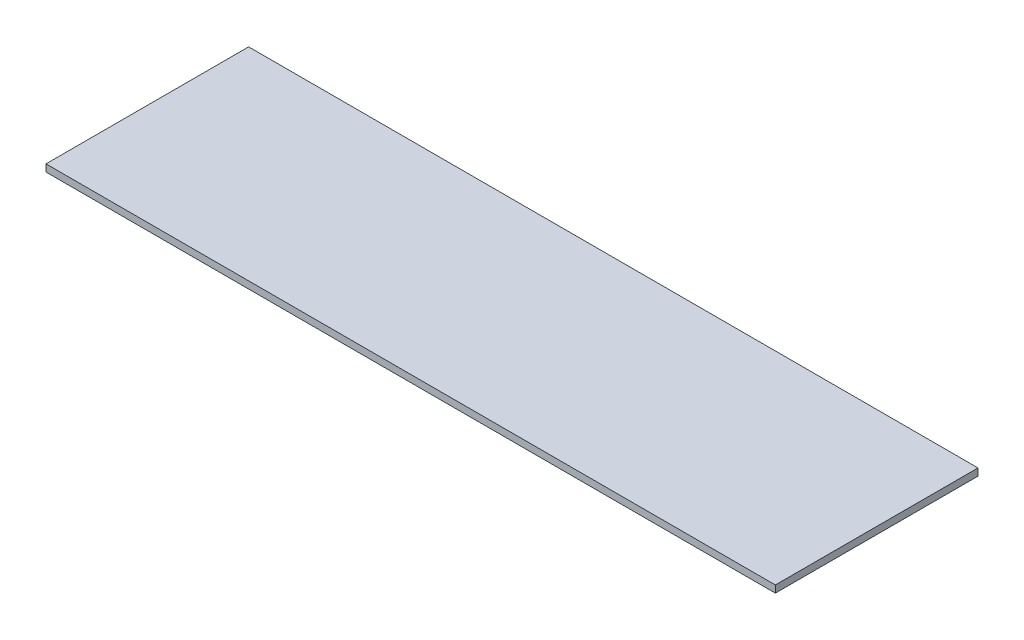
ISO-10303-21;
HEADER;
FILE_DESCRIPTION(('STEP AP214'),'2;1');
FILE_NAME('part.step','',(''),(''),'','','');
FILE_SCHEMA(('AUTOMOTIVE_DESIGN { 1 0 10303 214 1 1 1 1 }'));
ENDSEC;
DATA;
#1=APPLICATION_CONTEXT('core data for automotive mechanical design processes');
#2=APPLICATION_PROTOCOL_DEFINITION('international standard','automotive_design',2000,#1);
#3=PRODUCT_CONTEXT('',#1,'mechanical');
#4=PRODUCT('Part','Part','',(#3));
#5=PRODUCT_RELATED_PRODUCT_CATEGORY('part','',(#4));
#6=PRODUCT_DEFINITION_FORMATION('','',#4);
#7=PRODUCT_DEFINITION_CONTEXT('part definition',#1,'design');
#8=PRODUCT_DEFINITION('design','',#6,#7);
#9=PRODUCT_DEFINITION_SHAPE('','',#8);
#10=(LENGTH_UNIT() NAMED_UNIT(*) SI_UNIT(.MILLI.,.METRE.));
#11=(NAMED_UNIT(*) PLANE_ANGLE_UNIT() SI_UNIT($,.RADIAN.));
#12=(NAMED_UNIT(*) SI_UNIT($,.STERADIAN.) SOLID_ANGLE_UNIT());
#13=UNCERTAINTY_MEASURE_WITH_UNIT(LENGTH_MEASURE(1.E-05),#10,'distance_accuracy_value','');
#14=(GEOMETRIC_REPRESENTATION_CONTEXT(3) GLOBAL_UNCERTAINTY_ASSIGNED_CONTEXT((#13)) GLOBAL_UNIT_ASSIGNED_CONTEXT((#10,
#11,#12)) REPRESENTATION_CONTEXT('',''));
#15=CARTESIAN_POINT('',(0.,0.,0.));
#16=DIRECTION('',(0.,0.,1.));
#17=DIRECTION('',(1.,0.,0.));
#18=AXIS2_PLACEMENT_3D('',#15,#16,#17);
#19=CARTESIAN_POINT('',(-425.728806941432,5.,-49.8109978308026));
#20=DIRECTION('',(0.,0.,-1.));
#21=DIRECTION('',(-1.,0.,0.));
#22=AXIS2_PLACEMENT_3D('',#19,#20,#21);
#23=PLANE('',#22);
#24=DIRECTION('',(1.,0.,0.));
#25=VECTOR('',#24,1.);
#26=CARTESIAN_POINT('',(-425.728806941432,0.,-49.8109978308026));
#27=LINE('',#26,#25);
#28=CARTESIAN_POINT('',(-425.728806941432,0.,-49.8109978308026));
#29=VERTEX_POINT('',#28);
#30=CARTESIAN_POINT('',(87.0711930585684,0.,-49.8109978308026));
#31=VERTEX_POINT('',#30);
#32=EDGE_CURVE('E105',#29,#31,#27,.T.);
#33=ORIENTED_EDGE('',*,*,#32,.F.);
#34=DIRECTION('',(0.,-1.,0.));
#35=VECTOR('',#34,1.);
#36=CARTESIAN_POINT('',(-425.728806941432,5.,-49.8109978308026));
#37=LINE('',#36,#35);
#38=CARTESIAN_POINT('',(-425.728806941432,5.,-49.8109978308026));
#39=VERTEX_POINT('',#38);
#40=EDGE_CURVE('E11',#39,#29,#37,.T.);
#41=ORIENTED_EDGE('',*,*,#40,.F.);
#42=DIRECTION('',(1.,0.,0.));
#43=VECTOR('',#42,1.);
#44=CARTESIAN_POINT('',(-425.728806941432,5.,-49.8109978308026));
#45=LINE('',#44,#43);
#46=CARTESIAN_POINT('',(87.0711930585684,5.,-49.8109978308026));
#47=VERTEX_POINT('',#46);
#48=EDGE_CURVE('E100',#39,#47,#45,.T.);
#49=ORIENTED_EDGE('',*,*,#48,.T.);
#50=DIRECTION('',(0.,-1.,0.));
#51=VECTOR('',#50,1.);
#52=CARTESIAN_POINT('',(87.0711930585684,5.,-49.8109978308026));
#53=LINE('',#52,#51);
#54=EDGE_CURVE('E43',#47,#31,#53,.T.);
#55=ORIENTED_EDGE('',*,*,#54,.T.);
#56=EDGE_LOOP('',(#33,#41,#49,#55));
#57=FACE_BOUND('',#56,.T.);
#58=ADVANCED_FACE('F40',(#57),#23,.T.);
#59=CARTESIAN_POINT('',(-425.728806941432,5.,-49.8109978308026));
#60=DIRECTION('',(1.,0.,0.));
#61=DIRECTION('',(0.,0.,-1.));
#62=AXIS2_PLACEMENT_3D('',#59,#60,#61);
#63=PLANE('',#62);
#64=DIRECTION('',(0.,0.,1.));
#65=VECTOR('',#64,1.);
#66=CARTESIAN_POINT('',(-425.728806941432,0.,-49.8109978308026));
#67=LINE('',#66,#65);
#68=CARTESIAN_POINT('',(-425.728806941432,0.,92.6690021691974));
#69=VERTEX_POINT('',#68);
#70=EDGE_CURVE('E73',#29,#69,#67,.T.);
#71=ORIENTED_EDGE('',*,*,#70,.T.);
#72=DIRECTION('',(0.,-1.,0.));
#73=VECTOR('',#72,1.);
#74=CARTESIAN_POINT('',(-425.728806941432,5.,92.6690021691974));
#75=LINE('',#74,#73);
#76=CARTESIAN_POINT('',(-425.728806941432,5.,92.6690021691974));
#77=VERTEX_POINT('',#76);
#78=EDGE_CURVE('E49',#77,#69,#75,.T.);
#79=ORIENTED_EDGE('',*,*,#78,.F.);
#80=DIRECTION('',(0.,0.,1.));
#81=VECTOR('',#80,1.);
#82=CARTESIAN_POINT('',(-425.728806941432,5.,-49.8109978308026));
#83=LINE('',#82,#81);
#84=EDGE_CURVE('E90',#39,#77,#83,.T.);
#85=ORIENTED_EDGE('',*,*,#84,.F.);
#86=ORIENTED_EDGE('',*,*,#40,.T.);
#87=EDGE_LOOP('',(#71,#79,#85,#86));
#88=FACE_BOUND('',#87,.T.);
#89=ADVANCED_FACE('F115',(#88),#63,.F.);
#90=CARTESIAN_POINT('',(-425.728806941432,5.,92.6690021691974));
#91=DIRECTION('',(0.,0.,-1.));
#92=DIRECTION('',(-1.,0.,0.));
#93=AXIS2_PLACEMENT_3D('',#90,#91,#92);
#94=PLANE('',#93);
#95=DIRECTION('',(1.,0.,0.));
#96=VECTOR('',#95,1.);
#97=CARTESIAN_POINT('',(-425.728806941432,0.,92.6690021691974));
#98=LINE('',#97,#96);
#99=CARTESIAN_POINT('',(87.0711930585684,0.,92.6690021691974));
#100=VERTEX_POINT('',#99);
#101=EDGE_CURVE('E97',#69,#100,#98,.T.);
#102=ORIENTED_EDGE('',*,*,#101,.T.);
#103=DIRECTION('',(0.,-1.,0.));
#104=VECTOR('',#103,1.);
#105=CARTESIAN_POINT('',(87.0711930585684,5.,92.6690021691974));
#106=LINE('',#105,#104);
#107=CARTESIAN_POINT('',(87.0711930585684,5.,92.6690021691974));
#108=VERTEX_POINT('',#107);
#109=EDGE_CURVE('E94',#108,#100,#106,.T.);
#110=ORIENTED_EDGE('',*,*,#109,.F.);
#111=DIRECTION('',(1.,0.,0.));
#112=VECTOR('',#111,1.);
#113=CARTESIAN_POINT('',(-425.728806941432,5.,92.6690021691974));
#114=LINE('',#113,#112);
#115=EDGE_CURVE('E85',#77,#108,#114,.T.);
#116=ORIENTED_EDGE('',*,*,#115,.F.);
#117=ORIENTED_EDGE('',*,*,#78,.T.);
#118=EDGE_LOOP('',(#102,#110,#116,#117));
#119=FACE_BOUND('',#118,.T.);
#120=ADVANCED_FACE('F95',(#119),#94,.F.);
#121=CARTESIAN_POINT('',(87.0711930585684,5.,-49.8109978308026));
#122=DIRECTION('',(1.,0.,0.));
#123=DIRECTION('',(0.,0.,-1.));
#124=AXIS2_PLACEMENT_3D('',#121,#122,#123);
#125=PLANE('',#124);
#126=DIRECTION('',(0.,0.,1.));
#127=VECTOR('',#126,1.);
#128=CARTESIAN_POINT('',(87.0711930585684,0.,-49.8109978308026));
#129=LINE('',#128,#127);
#130=EDGE_CURVE('E108',#31,#100,#129,.T.);
#131=ORIENTED_EDGE('',*,*,#130,.F.);
#132=ORIENTED_EDGE('',*,*,#54,.F.);
#133=DIRECTION('',(0.,0.,1.));
#134=VECTOR('',#133,1.);
#135=CARTESIAN_POINT('',(87.0711930585684,5.,-49.8109978308026));
#136=LINE('',#135,#134);
#137=EDGE_CURVE('E89',#47,#108,#136,.T.);
#138=ORIENTED_EDGE('',*,*,#137,.T.);
#139=ORIENTED_EDGE('',*,*,#109,.T.);
#140=EDGE_LOOP('',(#131,#132,#138,#139));
#141=FACE_BOUND('',#140,.T.);
#142=ADVANCED_FACE('F99',(#141),#125,.T.);
#143=CARTESIAN_POINT('',(0.,5.,0.));
#144=DIRECTION('',(0.,-1.,0.));
#145=DIRECTION('',(0.,0.,-1.));
#146=AXIS2_PLACEMENT_3D('',#143,#144,#145);
#147=PLANE('',#146);
#148=ORIENTED_EDGE('',*,*,#48,.F.);
#149=ORIENTED_EDGE('',*,*,#84,.T.);
#150=ORIENTED_EDGE('',*,*,#115,.T.);
#151=ORIENTED_EDGE('',*,*,#137,.F.);
#152=EDGE_LOOP('',(#148,#149,#150,#151));
#153=FACE_BOUND('',#152,.T.);
#154=ADVANCED_FACE('F88',(#153),#147,.F.);
#155=CARTESIAN_POINT('',(0.,0.,0.));
#156=DIRECTION('',(0.,-1.,0.));
#157=DIRECTION('',(0.,0.,-1.));
#158=AXIS2_PLACEMENT_3D('',#155,#156,#157);
#159=PLANE('',#158);
#160=ORIENTED_EDGE('',*,*,#32,.T.);
#161=ORIENTED_EDGE('',*,*,#130,.T.);
#162=ORIENTED_EDGE('',*,*,#101,.F.);
#163=ORIENTED_EDGE('',*,*,#70,.F.);
#164=EDGE_LOOP('',(#160,#161,#162,#163));
#165=FACE_BOUND('',#164,.T.);
#166=ADVANCED_FACE('F113',(#165),#159,.T.);
#167=CLOSED_SHELL('',(#58,#89,#120,#142,#154,#166));
#168=MANIFOLD_SOLID_BREP('B2',#167);
#169=ADVANCED_BREP_SHAPE_REPRESENTATION('',(#18,#168),#14);
#170=SHAPE_DEFINITION_REPRESENTATION(#9,#169);
ENDSEC;
END-ISO-10303-21;
